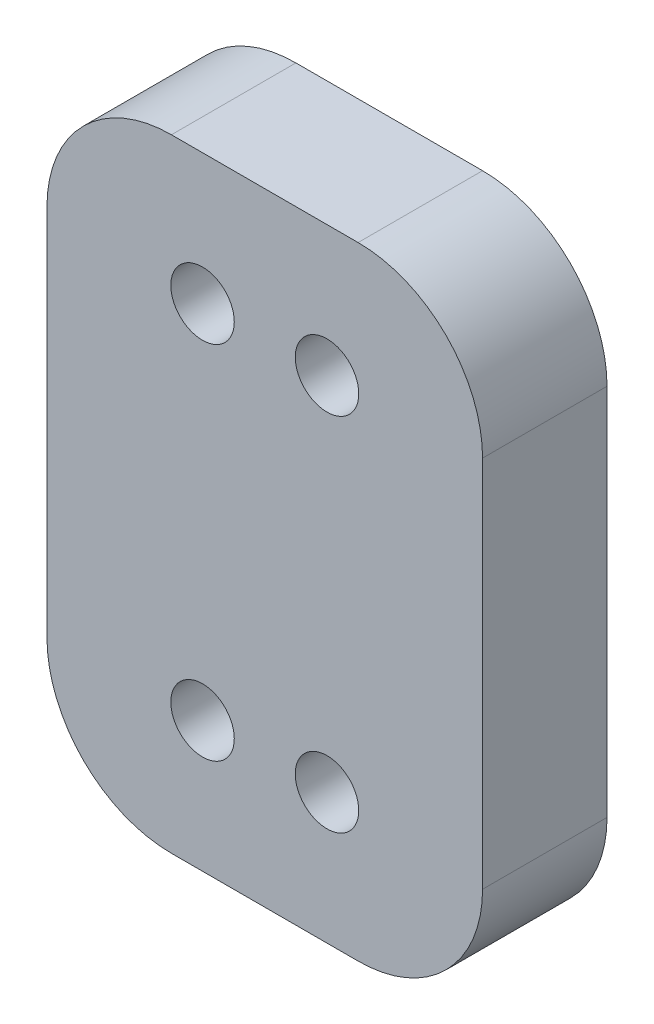
ISO-10303-21;
HEADER;
FILE_DESCRIPTION(('STEP AP214'),'2;1');
FILE_NAME('part.step','',(''),(''),'','','');
FILE_SCHEMA(('AUTOMOTIVE_DESIGN { 1 0 10303 214 1 1 1 1 }'));
ENDSEC;
DATA;
#1=APPLICATION_CONTEXT('core data for automotive mechanical design processes');
#2=APPLICATION_PROTOCOL_DEFINITION('international standard','automotive_design',2000,#1);
#3=PRODUCT_CONTEXT('',#1,'mechanical');
#4=PRODUCT('Part','Part','',(#3));
#5=PRODUCT_RELATED_PRODUCT_CATEGORY('part','',(#4));
#6=PRODUCT_DEFINITION_FORMATION('','',#4);
#7=PRODUCT_DEFINITION_CONTEXT('part definition',#1,'design');
#8=PRODUCT_DEFINITION('design','',#6,#7);
#9=PRODUCT_DEFINITION_SHAPE('','',#8);
#10=(LENGTH_UNIT() NAMED_UNIT(*) SI_UNIT(.MILLI.,.METRE.));
#11=(NAMED_UNIT(*) PLANE_ANGLE_UNIT() SI_UNIT($,.RADIAN.));
#12=(NAMED_UNIT(*) SI_UNIT($,.STERADIAN.) SOLID_ANGLE_UNIT());
#13=UNCERTAINTY_MEASURE_WITH_UNIT(LENGTH_MEASURE(1.E-05),#10,'distance_accuracy_value','');
#14=(GEOMETRIC_REPRESENTATION_CONTEXT(3) GLOBAL_UNCERTAINTY_ASSIGNED_CONTEXT((#13)) GLOBAL_UNIT_ASSIGNED_CONTEXT((#10,
#11,#12)) REPRESENTATION_CONTEXT('',''));
#15=CARTESIAN_POINT('',(0.,0.,0.));
#16=DIRECTION('',(0.,0.,1.));
#17=DIRECTION('',(1.,0.,0.));
#18=AXIS2_PLACEMENT_3D('',#15,#16,#17);
#19=CARTESIAN_POINT('',(-3.52281753999145,747.237393461443,10.));
#20=DIRECTION('',(0.,0.,1.));
#21=DIRECTION('',(1.,0.,0.));
#22=AXIS2_PLACEMENT_3D('',#19,#20,#21);
#23=PLANE('',#22);
#24=CARTESIAN_POINT('',(-6.02281753999304,717.737393462638,10.));
#25=DIRECTION('',(0.,0.,1.));
#26=DIRECTION('',(1.,0.,0.));
#27=AXIS2_PLACEMENT_3D('',#24,#25,#26);
#28=CIRCLE('',#27,2.54999999999999);
#29=CARTESIAN_POINT('',(-3.47281753999305,717.737393462638,10.));
#30=VERTEX_POINT('',#29);
#31=EDGE_CURVE('E190',#30,#30,#28,.T.);
#32=ORIENTED_EDGE('',*,*,#31,.F.);
#33=EDGE_LOOP('',(#32));
#34=FACE_BOUND('',#33,.T.);
#35=CARTESIAN_POINT('',(-16.0228175399929,746.737393462638,10.));
#36=DIRECTION('',(0.,0.,1.));
#37=DIRECTION('',(1.,0.,0.));
#38=AXIS2_PLACEMENT_3D('',#35,#36,#37);
#39=CIRCLE('',#38,2.54999999999999);
#40=CARTESIAN_POINT('',(-13.4728175399929,746.737393462638,10.));
#41=VERTEX_POINT('',#40);
#42=EDGE_CURVE('E136',#41,#41,#39,.T.);
#43=ORIENTED_EDGE('',*,*,#42,.F.);
#44=EDGE_LOOP('',(#43));
#45=FACE_BOUND('',#44,.T.);
#46=CARTESIAN_POINT('',(-3.52281753999145,747.237393461443,10.));
#47=DIRECTION('',(0.,0.,1.));
#48=DIRECTION('',(1.,0.,0.));
#49=AXIS2_PLACEMENT_3D('',#46,#47,#48);
#50=CIRCLE('',#49,9.99999999999904);
#51=CARTESIAN_POINT('',(6.47718246000761,747.237393461443,10.));
#52=VERTEX_POINT('',#51);
#53=CARTESIAN_POINT('',(-3.52281753999267,757.237393461442,10.));
#54=VERTEX_POINT('',#53);
#55=EDGE_CURVE('E147',#52,#54,#50,.T.);
#56=ORIENTED_EDGE('',*,*,#55,.T.);
#57=DIRECTION('',(-1.,0.,0.));
#58=VECTOR('',#57,1.);
#59=CARTESIAN_POINT('',(-18.5228175399931,757.237393461442,10.));
#60=LINE('',#59,#58);
#61=CARTESIAN_POINT('',(-18.5228175399931,757.237393461442,10.));
#62=VERTEX_POINT('',#61);
#63=EDGE_CURVE('E95',#54,#62,#60,.T.);
#64=ORIENTED_EDGE('',*,*,#63,.T.);
#65=CARTESIAN_POINT('',(-18.5228175399943,747.237393461443,10.));
#66=DIRECTION('',(0.,0.,1.));
#67=DIRECTION('',(-1.,0.,0.));
#68=AXIS2_PLACEMENT_3D('',#65,#66,#67);
#69=CIRCLE('',#68,9.99999999999904);
#70=CARTESIAN_POINT('',(-28.5228175399934,747.237393461443,10.));
#71=VERTEX_POINT('',#70);
#72=EDGE_CURVE('E162',#62,#71,#69,.T.);
#73=ORIENTED_EDGE('',*,*,#72,.T.);
#74=DIRECTION('',(0.,-1.,0.));
#75=VECTOR('',#74,1.);
#76=CARTESIAN_POINT('',(-28.5228175399939,717.237393461443,10.));
#77=LINE('',#76,#75);
#78=CARTESIAN_POINT('',(-28.5228175399939,717.237393461443,10.));
#79=VERTEX_POINT('',#78);
#80=EDGE_CURVE('E175',#71,#79,#77,.T.);
#81=ORIENTED_EDGE('',*,*,#80,.T.);
#82=CARTESIAN_POINT('',(-18.5228175399928,717.237393461443,10.));
#83=DIRECTION('',(0.,0.,1.));
#84=DIRECTION('',(-1.,0.,0.));
#85=AXIS2_PLACEMENT_3D('',#82,#83,#84);
#86=CIRCLE('',#85,10.0000000000011);
#87=CARTESIAN_POINT('',(-18.5228175399924,707.237393461441,10.));
#88=VERTEX_POINT('',#87);
#89=EDGE_CURVE('E114',#79,#88,#86,.T.);
#90=ORIENTED_EDGE('',*,*,#89,.T.);
#91=DIRECTION('',(1.,0.,0.));
#92=VECTOR('',#91,1.);
#93=CARTESIAN_POINT('',(-18.5228175399924,707.237393461441,10.));
#94=LINE('',#93,#92);
#95=CARTESIAN_POINT('',(-3.5228175399934,707.237393461441,10.));
#96=VERTEX_POINT('',#95);
#97=EDGE_CURVE('E108',#88,#96,#94,.T.);
#98=ORIENTED_EDGE('',*,*,#97,.T.);
#99=CARTESIAN_POINT('',(-3.52281753999295,717.237393461443,10.));
#100=DIRECTION('',(0.,0.,1.));
#101=DIRECTION('',(1.,0.,0.));
#102=AXIS2_PLACEMENT_3D('',#99,#100,#101);
#103=CIRCLE('',#102,10.0000000000011);
#104=CARTESIAN_POINT('',(6.47718246000813,717.237393461443,10.));
#105=VERTEX_POINT('',#104);
#106=EDGE_CURVE('E112',#96,#105,#103,.T.);
#107=ORIENTED_EDGE('',*,*,#106,.T.);
#108=DIRECTION('',(0.,1.,0.));
#109=VECTOR('',#108,1.);
#110=CARTESIAN_POINT('',(6.47718246000813,717.237393461443,10.));
#111=LINE('',#110,#109);
#112=EDGE_CURVE('E52',#105,#52,#111,.T.);
#113=ORIENTED_EDGE('',*,*,#112,.T.);
#114=EDGE_LOOP('',(#56,#64,#73,#81,#90,#98,#107,#113));
#115=FACE_BOUND('',#114,.T.);
#116=CARTESIAN_POINT('',(-6.02281753999289,746.737393462638,10.));
#117=DIRECTION('',(0.,0.,1.));
#118=DIRECTION('',(1.,0.,0.));
#119=AXIS2_PLACEMENT_3D('',#116,#117,#118);
#120=CIRCLE('',#119,2.54999999999999);
#121=CARTESIAN_POINT('',(-3.4728175399929,746.737393462638,10.));
#122=VERTEX_POINT('',#121);
#123=EDGE_CURVE('E184',#122,#122,#120,.T.);
#124=ORIENTED_EDGE('',*,*,#123,.F.);
#125=EDGE_LOOP('',(#124));
#126=FACE_BOUND('',#125,.T.);
#127=CARTESIAN_POINT('',(-16.022817539993,717.737393462638,10.));
#128=DIRECTION('',(0.,0.,1.));
#129=DIRECTION('',(1.,0.,0.));
#130=AXIS2_PLACEMENT_3D('',#127,#128,#129);
#131=CIRCLE('',#130,2.54999999999999);
#132=CARTESIAN_POINT('',(-13.4728175399931,717.737393462638,10.));
#133=VERTEX_POINT('',#132);
#134=EDGE_CURVE('E196',#133,#133,#131,.T.);
#135=ORIENTED_EDGE('',*,*,#134,.F.);
#136=EDGE_LOOP('',(#135));
#137=FACE_BOUND('',#136,.T.);
#138=ADVANCED_FACE('F35',(#34,#45,#115,#126,#137),#23,.T.);
#139=CARTESIAN_POINT('',(-3.52281753999145,747.237393461443,0.));
#140=DIRECTION('',(0.,0.,1.));
#141=DIRECTION('',(1.,0.,0.));
#142=AXIS2_PLACEMENT_3D('',#139,#140,#141);
#143=PLANE('',#142);
#144=CARTESIAN_POINT('',(-6.02281753999304,717.737393462638,0.));
#145=DIRECTION('',(0.,0.,1.));
#146=DIRECTION('',(1.,0.,0.));
#147=AXIS2_PLACEMENT_3D('',#144,#145,#146);
#148=CIRCLE('',#147,2.54999999999999);
#149=CARTESIAN_POINT('',(-3.47281753999305,717.737393462638,0.));
#150=VERTEX_POINT('',#149);
#151=EDGE_CURVE('E193',#150,#150,#148,.T.);
#152=ORIENTED_EDGE('',*,*,#151,.T.);
#153=EDGE_LOOP('',(#152));
#154=FACE_BOUND('',#153,.T.);
#155=CARTESIAN_POINT('',(-16.0228175399929,746.737393462638,0.));
#156=DIRECTION('',(0.,0.,1.));
#157=DIRECTION('',(1.,0.,0.));
#158=AXIS2_PLACEMENT_3D('',#155,#156,#157);
#159=CIRCLE('',#158,2.54999999999999);
#160=CARTESIAN_POINT('',(-13.4728175399929,746.737393462638,0.));
#161=VERTEX_POINT('',#160);
#162=EDGE_CURVE('E181',#161,#161,#159,.T.);
#163=ORIENTED_EDGE('',*,*,#162,.T.);
#164=EDGE_LOOP('',(#163));
#165=FACE_BOUND('',#164,.T.);
#166=CARTESIAN_POINT('',(-3.52281753999145,747.237393461443,0.));
#167=DIRECTION('',(0.,0.,1.));
#168=DIRECTION('',(1.,0.,0.));
#169=AXIS2_PLACEMENT_3D('',#166,#167,#168);
#170=CIRCLE('',#169,9.99999999999904);
#171=CARTESIAN_POINT('',(6.47718246000761,747.237393461443,0.));
#172=VERTEX_POINT('',#171);
#173=CARTESIAN_POINT('',(-3.52281753999267,757.237393461442,0.));
#174=VERTEX_POINT('',#173);
#175=EDGE_CURVE('E132',#172,#174,#170,.T.);
#176=ORIENTED_EDGE('',*,*,#175,.F.);
#177=DIRECTION('',(0.,1.,0.));
#178=VECTOR('',#177,1.);
#179=CARTESIAN_POINT('',(6.47718246000813,717.237393461443,0.));
#180=LINE('',#179,#178);
#181=CARTESIAN_POINT('',(6.47718246000813,717.237393461443,0.));
#182=VERTEX_POINT('',#181);
#183=EDGE_CURVE('E87',#182,#172,#180,.T.);
#184=ORIENTED_EDGE('',*,*,#183,.F.);
#185=CARTESIAN_POINT('',(-3.52281753999295,717.237393461443,0.));
#186=DIRECTION('',(0.,0.,1.));
#187=DIRECTION('',(1.,0.,0.));
#188=AXIS2_PLACEMENT_3D('',#185,#186,#187);
#189=CIRCLE('',#188,10.0000000000011);
#190=CARTESIAN_POINT('',(-3.5228175399934,707.237393461441,0.));
#191=VERTEX_POINT('',#190);
#192=EDGE_CURVE('E81',#191,#182,#189,.T.);
#193=ORIENTED_EDGE('',*,*,#192,.F.);
#194=DIRECTION('',(1.,0.,0.));
#195=VECTOR('',#194,1.);
#196=CARTESIAN_POINT('',(-18.5228175399924,707.237393461441,0.));
#197=LINE('',#196,#195);
#198=CARTESIAN_POINT('',(-18.5228175399924,707.237393461441,0.));
#199=VERTEX_POINT('',#198);
#200=EDGE_CURVE('E122',#199,#191,#197,.T.);
#201=ORIENTED_EDGE('',*,*,#200,.F.);
#202=CARTESIAN_POINT('',(-18.5228175399928,717.237393461443,0.));
#203=DIRECTION('',(0.,0.,1.));
#204=DIRECTION('',(-1.,0.,0.));
#205=AXIS2_PLACEMENT_3D('',#202,#203,#204);
#206=CIRCLE('',#205,10.0000000000011);
#207=CARTESIAN_POINT('',(-28.5228175399939,717.237393461443,0.));
#208=VERTEX_POINT('',#207);
#209=EDGE_CURVE('E142',#208,#199,#206,.T.);
#210=ORIENTED_EDGE('',*,*,#209,.F.);
#211=DIRECTION('',(0.,-1.,0.));
#212=VECTOR('',#211,1.);
#213=CARTESIAN_POINT('',(-28.5228175399939,717.237393461443,0.));
#214=LINE('',#213,#212);
#215=CARTESIAN_POINT('',(-28.5228175399934,747.237393461443,0.));
#216=VERTEX_POINT('',#215);
#217=EDGE_CURVE('E140',#216,#208,#214,.T.);
#218=ORIENTED_EDGE('',*,*,#217,.F.);
#219=CARTESIAN_POINT('',(-18.5228175399943,747.237393461443,0.));
#220=DIRECTION('',(0.,0.,1.));
#221=DIRECTION('',(-1.,0.,0.));
#222=AXIS2_PLACEMENT_3D('',#219,#220,#221);
#223=CIRCLE('',#222,9.99999999999904);
#224=CARTESIAN_POINT('',(-18.5228175399931,757.237393461442,0.));
#225=VERTEX_POINT('',#224);
#226=EDGE_CURVE('E138',#225,#216,#223,.T.);
#227=ORIENTED_EDGE('',*,*,#226,.F.);
#228=DIRECTION('',(-1.,0.,0.));
#229=VECTOR('',#228,1.);
#230=CARTESIAN_POINT('',(-18.5228175399931,757.237393461442,0.));
#231=LINE('',#230,#229);
#232=EDGE_CURVE('E135',#174,#225,#231,.T.);
#233=ORIENTED_EDGE('',*,*,#232,.F.);
#234=EDGE_LOOP('',(#176,#184,#193,#201,#210,#218,#227,#233));
#235=FACE_BOUND('',#234,.T.);
#236=CARTESIAN_POINT('',(-6.02281753999289,746.737393462638,0.));
#237=DIRECTION('',(0.,0.,1.));
#238=DIRECTION('',(1.,0.,0.));
#239=AXIS2_PLACEMENT_3D('',#236,#237,#238);
#240=CIRCLE('',#239,2.54999999999999);
#241=CARTESIAN_POINT('',(-3.4728175399929,746.737393462638,0.));
#242=VERTEX_POINT('',#241);
#243=EDGE_CURVE('E187',#242,#242,#240,.T.);
#244=ORIENTED_EDGE('',*,*,#243,.T.);
#245=EDGE_LOOP('',(#244));
#246=FACE_BOUND('',#245,.T.);
#247=CARTESIAN_POINT('',(-16.022817539993,717.737393462638,0.));
#248=DIRECTION('',(0.,0.,1.));
#249=DIRECTION('',(1.,0.,0.));
#250=AXIS2_PLACEMENT_3D('',#247,#248,#249);
#251=CIRCLE('',#250,2.54999999999999);
#252=CARTESIAN_POINT('',(-13.4728175399931,717.737393462638,0.));
#253=VERTEX_POINT('',#252);
#254=EDGE_CURVE('E199',#253,#253,#251,.T.);
#255=ORIENTED_EDGE('',*,*,#254,.T.);
#256=EDGE_LOOP('',(#255));
#257=FACE_BOUND('',#256,.T.);
#258=ADVANCED_FACE('F166',(#154,#165,#235,#246,#257),#143,.F.);
#259=CARTESIAN_POINT('',(-3.52281753999145,747.237393461443,10.));
#260=DIRECTION('',(0.,0.,-1.));
#261=DIRECTION('',(-1.,0.,0.));
#262=AXIS2_PLACEMENT_3D('',#259,#260,#261);
#263=CYLINDRICAL_SURFACE('',#262,9.99999999999904);
#264=ORIENTED_EDGE('',*,*,#175,.T.);
#265=DIRECTION('',(0.,0.,-1.));
#266=VECTOR('',#265,1.);
#267=CARTESIAN_POINT('',(-3.52281753999267,757.237393461442,10.));
#268=LINE('',#267,#266);
#269=EDGE_CURVE('E11',#54,#174,#268,.T.);
#270=ORIENTED_EDGE('',*,*,#269,.F.);
#271=ORIENTED_EDGE('',*,*,#55,.F.);
#272=DIRECTION('',(0.,0.,-1.));
#273=VECTOR('',#272,1.);
#274=CARTESIAN_POINT('',(6.47718246000761,747.237393461443,10.));
#275=LINE('',#274,#273);
#276=EDGE_CURVE('E128',#52,#172,#275,.T.);
#277=ORIENTED_EDGE('',*,*,#276,.T.);
#278=EDGE_LOOP('',(#264,#270,#271,#277));
#279=FACE_BOUND('',#278,.T.);
#280=ADVANCED_FACE('F37',(#279),#263,.T.);
#281=CARTESIAN_POINT('',(-18.5228175399931,757.237393461442,10.));
#282=DIRECTION('',(0.,-1.,0.));
#283=DIRECTION('',(0.,0.,-1.));
#284=AXIS2_PLACEMENT_3D('',#281,#282,#283);
#285=PLANE('',#284);
#286=ORIENTED_EDGE('',*,*,#232,.T.);
#287=DIRECTION('',(0.,0.,-1.));
#288=VECTOR('',#287,1.);
#289=CARTESIAN_POINT('',(-18.5228175399931,757.237393461442,10.));
#290=LINE('',#289,#288);
#291=EDGE_CURVE('E44',#62,#225,#290,.T.);
#292=ORIENTED_EDGE('',*,*,#291,.F.);
#293=ORIENTED_EDGE('',*,*,#63,.F.);
#294=ORIENTED_EDGE('',*,*,#269,.T.);
#295=EDGE_LOOP('',(#286,#292,#293,#294));
#296=FACE_BOUND('',#295,.T.);
#297=ADVANCED_FACE('F234',(#296),#285,.F.);
#298=CARTESIAN_POINT('',(-18.5228175399943,747.237393461443,10.));
#299=DIRECTION('',(0.,0.,-1.));
#300=DIRECTION('',(-1.,0.,0.));
#301=AXIS2_PLACEMENT_3D('',#298,#299,#300);
#302=CYLINDRICAL_SURFACE('',#301,9.99999999999904);
#303=ORIENTED_EDGE('',*,*,#226,.T.);
#304=DIRECTION('',(0.,0.,-1.));
#305=VECTOR('',#304,1.);
#306=CARTESIAN_POINT('',(-28.5228175399934,747.237393461443,10.));
#307=LINE('',#306,#305);
#308=EDGE_CURVE('E154',#71,#216,#307,.T.);
#309=ORIENTED_EDGE('',*,*,#308,.F.);
#310=ORIENTED_EDGE('',*,*,#72,.F.);
#311=ORIENTED_EDGE('',*,*,#291,.T.);
#312=EDGE_LOOP('',(#303,#309,#310,#311));
#313=FACE_BOUND('',#312,.T.);
#314=ADVANCED_FACE('F160',(#313),#302,.T.);
#315=CARTESIAN_POINT('',(-28.5228175399939,717.237393461443,10.));
#316=DIRECTION('',(1.,0.,0.));
#317=DIRECTION('',(0.,1.,0.));
#318=AXIS2_PLACEMENT_3D('',#315,#316,#317);
#319=PLANE('',#318);
#320=ORIENTED_EDGE('',*,*,#217,.T.);
#321=DIRECTION('',(0.,0.,-1.));
#322=VECTOR('',#321,1.);
#323=CARTESIAN_POINT('',(-28.5228175399939,717.237393461443,10.));
#324=LINE('',#323,#322);
#325=EDGE_CURVE('E151',#79,#208,#324,.T.);
#326=ORIENTED_EDGE('',*,*,#325,.F.);
#327=ORIENTED_EDGE('',*,*,#80,.F.);
#328=ORIENTED_EDGE('',*,*,#308,.T.);
#329=EDGE_LOOP('',(#320,#326,#327,#328));
#330=FACE_BOUND('',#329,.T.);
#331=ADVANCED_FACE('F171',(#330),#319,.F.);
#332=CARTESIAN_POINT('',(-18.5228175399928,717.237393461443,10.));
#333=DIRECTION('',(0.,0.,-1.));
#334=DIRECTION('',(-1.,0.,0.));
#335=AXIS2_PLACEMENT_3D('',#332,#333,#334);
#336=CYLINDRICAL_SURFACE('',#335,10.0000000000011);
#337=ORIENTED_EDGE('',*,*,#209,.T.);
#338=DIRECTION('',(0.,0.,-1.));
#339=VECTOR('',#338,1.);
#340=CARTESIAN_POINT('',(-18.5228175399924,707.237393461441,10.));
#341=LINE('',#340,#339);
#342=EDGE_CURVE('E123',#88,#199,#341,.T.);
#343=ORIENTED_EDGE('',*,*,#342,.F.);
#344=ORIENTED_EDGE('',*,*,#89,.F.);
#345=ORIENTED_EDGE('',*,*,#325,.T.);
#346=EDGE_LOOP('',(#337,#343,#344,#345));
#347=FACE_BOUND('',#346,.T.);
#348=ADVANCED_FACE('F174',(#347),#336,.T.);
#349=CARTESIAN_POINT('',(-18.5228175399924,707.237393461441,10.));
#350=DIRECTION('',(0.,1.,0.));
#351=DIRECTION('',(0.,0.,1.));
#352=AXIS2_PLACEMENT_3D('',#349,#350,#351);
#353=PLANE('',#352);
#354=ORIENTED_EDGE('',*,*,#200,.T.);
#355=DIRECTION('',(0.,0.,-1.));
#356=VECTOR('',#355,1.);
#357=CARTESIAN_POINT('',(-3.5228175399934,707.237393461441,10.));
#358=LINE('',#357,#356);
#359=EDGE_CURVE('E119',#96,#191,#358,.T.);
#360=ORIENTED_EDGE('',*,*,#359,.F.);
#361=ORIENTED_EDGE('',*,*,#97,.F.);
#362=ORIENTED_EDGE('',*,*,#342,.T.);
#363=EDGE_LOOP('',(#354,#360,#361,#362));
#364=FACE_BOUND('',#363,.T.);
#365=ADVANCED_FACE('F120',(#364),#353,.F.);
#366=CARTESIAN_POINT('',(-3.52281753999295,717.237393461443,10.));
#367=DIRECTION('',(0.,0.,-1.));
#368=DIRECTION('',(-1.,0.,0.));
#369=AXIS2_PLACEMENT_3D('',#366,#367,#368);
#370=CYLINDRICAL_SURFACE('',#369,10.0000000000011);
#371=ORIENTED_EDGE('',*,*,#192,.T.);
#372=DIRECTION('',(0.,0.,-1.));
#373=VECTOR('',#372,1.);
#374=CARTESIAN_POINT('',(6.47718246000813,717.237393461443,10.));
#375=LINE('',#374,#373);
#376=EDGE_CURVE('E124',#105,#182,#375,.T.);
#377=ORIENTED_EDGE('',*,*,#376,.F.);
#378=ORIENTED_EDGE('',*,*,#106,.F.);
#379=ORIENTED_EDGE('',*,*,#359,.T.);
#380=EDGE_LOOP('',(#371,#377,#378,#379));
#381=FACE_BOUND('',#380,.T.);
#382=ADVANCED_FACE('F126',(#381),#370,.T.);
#383=CARTESIAN_POINT('',(6.47718246000813,717.237393461443,10.));
#384=DIRECTION('',(-1.,0.,0.));
#385=DIRECTION('',(0.,-1.,0.));
#386=AXIS2_PLACEMENT_3D('',#383,#384,#385);
#387=PLANE('',#386);
#388=ORIENTED_EDGE('',*,*,#183,.T.);
#389=ORIENTED_EDGE('',*,*,#276,.F.);
#390=ORIENTED_EDGE('',*,*,#112,.F.);
#391=ORIENTED_EDGE('',*,*,#376,.T.);
#392=EDGE_LOOP('',(#388,#389,#390,#391));
#393=FACE_BOUND('',#392,.T.);
#394=ADVANCED_FACE('F222',(#393),#387,.F.);
#395=CARTESIAN_POINT('',(-16.0228175399929,746.737393462638,10.));
#396=DIRECTION('',(0.,0.,-1.));
#397=DIRECTION('',(-1.,0.,0.));
#398=AXIS2_PLACEMENT_3D('',#395,#396,#397);
#399=CYLINDRICAL_SURFACE('',#398,2.54999999999999);
#400=ORIENTED_EDGE('',*,*,#42,.T.);
#401=EDGE_LOOP('',(#400));
#402=FACE_BOUND('',#401,.T.);
#403=ORIENTED_EDGE('',*,*,#162,.F.);
#404=EDGE_LOOP('',(#403));
#405=FACE_BOUND('',#404,.T.);
#406=ADVANCED_FACE('F219',(#402,#405),#399,.F.);
#407=CARTESIAN_POINT('',(-6.02281753999289,746.737393462638,10.));
#408=DIRECTION('',(0.,0.,-1.));
#409=DIRECTION('',(-1.,0.,0.));
#410=AXIS2_PLACEMENT_3D('',#407,#408,#409);
#411=CYLINDRICAL_SURFACE('',#410,2.54999999999999);
#412=ORIENTED_EDGE('',*,*,#123,.T.);
#413=EDGE_LOOP('',(#412));
#414=FACE_BOUND('',#413,.T.);
#415=ORIENTED_EDGE('',*,*,#243,.F.);
#416=EDGE_LOOP('',(#415));
#417=FACE_BOUND('',#416,.T.);
#418=ADVANCED_FACE('F298',(#414,#417),#411,.F.);
#419=CARTESIAN_POINT('',(-6.02281753999304,717.737393462638,10.));
#420=DIRECTION('',(0.,0.,-1.));
#421=DIRECTION('',(-1.,0.,0.));
#422=AXIS2_PLACEMENT_3D('',#419,#420,#421);
#423=CYLINDRICAL_SURFACE('',#422,2.54999999999999);
#424=ORIENTED_EDGE('',*,*,#31,.T.);
#425=EDGE_LOOP('',(#424));
#426=FACE_BOUND('',#425,.T.);
#427=ORIENTED_EDGE('',*,*,#151,.F.);
#428=EDGE_LOOP('',(#427));
#429=FACE_BOUND('',#428,.T.);
#430=ADVANCED_FACE('F306',(#426,#429),#423,.F.);
#431=CARTESIAN_POINT('',(-16.022817539993,717.737393462638,10.));
#432=DIRECTION('',(0.,0.,-1.));
#433=DIRECTION('',(-1.,0.,0.));
#434=AXIS2_PLACEMENT_3D('',#431,#432,#433);
#435=CYLINDRICAL_SURFACE('',#434,2.54999999999999);
#436=ORIENTED_EDGE('',*,*,#134,.T.);
#437=EDGE_LOOP('',(#436));
#438=FACE_BOUND('',#437,.T.);
#439=ORIENTED_EDGE('',*,*,#254,.F.);
#440=EDGE_LOOP('',(#439));
#441=FACE_BOUND('',#440,.T.);
#442=ADVANCED_FACE('F205',(#438,#441),#435,.F.);
#443=CLOSED_SHELL('',(#138,#258,#280,#297,#314,#331,#348,#365,#382,#394,#406,#418,#430,#442));
#444=MANIFOLD_SOLID_BREP('B2',#443);
#445=ADVANCED_BREP_SHAPE_REPRESENTATION('',(#18,#444),#14);
#446=SHAPE_DEFINITION_REPRESENTATION(#9,#445);
ENDSEC;
END-ISO-10303-21;
